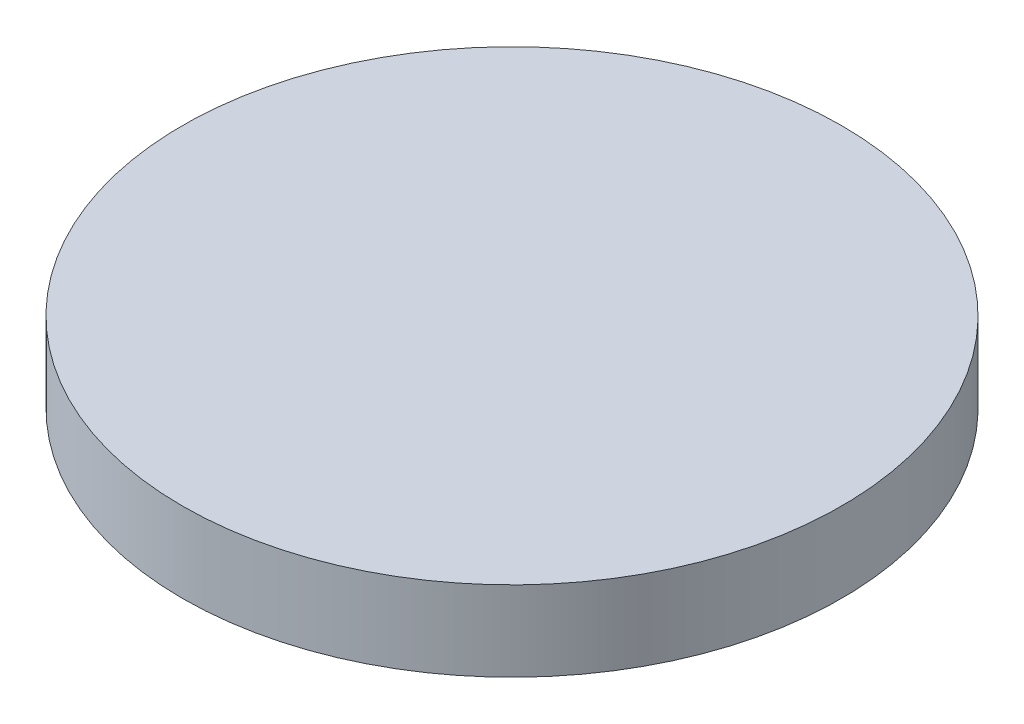
ISO-10303-21;
HEADER;
FILE_DESCRIPTION(('STEP AP214'),'2;1');
FILE_NAME('part.step','',(''),(''),'','','');
FILE_SCHEMA(('AUTOMOTIVE_DESIGN { 1 0 10303 214 1 1 1 1 }'));
ENDSEC;
DATA;
#1=APPLICATION_CONTEXT('core data for automotive mechanical design processes');
#2=APPLICATION_PROTOCOL_DEFINITION('international standard','automotive_design',2000,#1);
#3=PRODUCT_CONTEXT('',#1,'mechanical');
#4=PRODUCT('Part','Part','',(#3));
#5=PRODUCT_RELATED_PRODUCT_CATEGORY('part','',(#4));
#6=PRODUCT_DEFINITION_FORMATION('','',#4);
#7=PRODUCT_DEFINITION_CONTEXT('part definition',#1,'design');
#8=PRODUCT_DEFINITION('design','',#6,#7);
#9=PRODUCT_DEFINITION_SHAPE('','',#8);
#10=(LENGTH_UNIT() NAMED_UNIT(*) SI_UNIT(.MILLI.,.METRE.));
#11=(NAMED_UNIT(*) PLANE_ANGLE_UNIT() SI_UNIT($,.RADIAN.));
#12=(NAMED_UNIT(*) SI_UNIT($,.STERADIAN.) SOLID_ANGLE_UNIT());
#13=UNCERTAINTY_MEASURE_WITH_UNIT(LENGTH_MEASURE(1.E-05),#10,'distance_accuracy_value','');
#14=(GEOMETRIC_REPRESENTATION_CONTEXT(3) GLOBAL_UNCERTAINTY_ASSIGNED_CONTEXT((#13)) GLOBAL_UNIT_ASSIGNED_CONTEXT((#10,
#11,#12)) REPRESENTATION_CONTEXT('',''));
#15=CARTESIAN_POINT('',(0.,0.,0.));
#16=DIRECTION('',(0.,0.,1.));
#17=DIRECTION('',(1.,0.,0.));
#18=AXIS2_PLACEMENT_3D('',#15,#16,#17);
#19=CARTESIAN_POINT('',(0.,7.366,0.));
#20=DIRECTION('',(0.,-1.,0.));
#21=DIRECTION('',(0.,0.,-1.));
#22=AXIS2_PLACEMENT_3D('',#19,#20,#21);
#23=CYLINDRICAL_SURFACE('',#22,30.335461419149);
#24=CARTESIAN_POINT('',(0.,7.366,0.));
#25=DIRECTION('',(0.,1.,0.));
#26=DIRECTION('',(0.,0.,1.));
#27=AXIS2_PLACEMENT_3D('',#24,#25,#26);
#28=CIRCLE('',#27,30.335461419149);
#29=CARTESIAN_POINT('',(0.,7.366,-30.335461419149));
#30=VERTEX_POINT('',#29);
#31=EDGE_CURVE('E10',#30,#30,#28,.T.);
#32=CARTESIAN_POINT('',(0.,0.,0.));
#33=DIRECTION('',(0.,1.,0.));
#34=DIRECTION('',(0.,0.,1.));
#35=AXIS2_PLACEMENT_3D('',#32,#33,#34);
#36=CIRCLE('',#35,30.335461419149);
#37=CARTESIAN_POINT('',(0.,0.,-30.335461419149));
#38=VERTEX_POINT('',#37);
#39=EDGE_CURVE('E38',#38,#38,#36,.T.);
#40=CARTESIAN_POINT('',(0.,7.366,-30.335461419149));
#41=CARTESIAN_POINT('',(0.,7.28927083333333,-30.335461419149));
#42=CARTESIAN_POINT('',(0.,7.21254166666667,-30.335461419149));
#43=CARTESIAN_POINT('',(0.,7.05908333333333,-30.335461419149));
#44=CARTESIAN_POINT('',(0.,6.98235416666667,-30.335461419149));
#45=CARTESIAN_POINT('',(0.,6.82889583333333,-30.335461419149));
#46=CARTESIAN_POINT('',(0.,6.75216666666667,-30.335461419149));
#47=CARTESIAN_POINT('',(0.,6.59870833333333,-30.335461419149));
#48=CARTESIAN_POINT('',(0.,6.52197916666667,-30.335461419149));
#49=CARTESIAN_POINT('',(0.,6.36852083333333,-30.335461419149));
#50=CARTESIAN_POINT('',(0.,6.29179166666667,-30.335461419149));
#51=CARTESIAN_POINT('',(0.,6.13833333333333,-30.335461419149));
#52=CARTESIAN_POINT('',(0.,6.06160416666667,-30.335461419149));
#53=CARTESIAN_POINT('',(0.,5.90814583333333,-30.335461419149));
#54=CARTESIAN_POINT('',(0.,5.83141666666667,-30.335461419149));
#55=CARTESIAN_POINT('',(0.,5.67795833333333,-30.335461419149));
#56=CARTESIAN_POINT('',(0.,5.60122916666667,-30.335461419149));
#57=CARTESIAN_POINT('',(0.,5.44777083333333,-30.335461419149));
#58=CARTESIAN_POINT('',(0.,5.37104166666667,-30.335461419149));
#59=CARTESIAN_POINT('',(0.,5.21758333333333,-30.335461419149));
#60=CARTESIAN_POINT('',(0.,5.14085416666667,-30.335461419149));
#61=CARTESIAN_POINT('',(0.,4.98739583333333,-30.335461419149));
#62=CARTESIAN_POINT('',(0.,4.91066666666667,-30.335461419149));
#63=CARTESIAN_POINT('',(0.,4.75720833333333,-30.335461419149));
#64=CARTESIAN_POINT('',(0.,4.68047916666667,-30.335461419149));
#65=CARTESIAN_POINT('',(0.,4.52702083333333,-30.335461419149));
#66=CARTESIAN_POINT('',(0.,4.45029166666667,-30.335461419149));
#67=CARTESIAN_POINT('',(0.,4.29683333333333,-30.335461419149));
#68=CARTESIAN_POINT('',(0.,4.22010416666667,-30.335461419149));
#69=CARTESIAN_POINT('',(0.,4.06664583333333,-30.335461419149));
#70=CARTESIAN_POINT('',(0.,3.98991666666667,-30.335461419149));
#71=CARTESIAN_POINT('',(0.,3.83645833333333,-30.335461419149));
#72=CARTESIAN_POINT('',(0.,3.75972916666667,-30.335461419149));
#73=CARTESIAN_POINT('',(0.,3.60627083333333,-30.335461419149));
#74=CARTESIAN_POINT('',(0.,3.52954166666667,-30.335461419149));
#75=CARTESIAN_POINT('',(0.,3.37608333333333,-30.335461419149));
#76=CARTESIAN_POINT('',(0.,3.29935416666667,-30.335461419149));
#77=CARTESIAN_POINT('',(0.,3.14589583333333,-30.335461419149));
#78=CARTESIAN_POINT('',(0.,3.06916666666667,-30.335461419149));
#79=CARTESIAN_POINT('',(0.,2.91570833333333,-30.335461419149));
#80=CARTESIAN_POINT('',(0.,2.83897916666667,-30.335461419149));
#81=CARTESIAN_POINT('',(0.,2.68552083333333,-30.335461419149));
#82=CARTESIAN_POINT('',(0.,2.60879166666667,-30.335461419149));
#83=CARTESIAN_POINT('',(0.,2.45533333333333,-30.335461419149));
#84=CARTESIAN_POINT('',(0.,2.37860416666667,-30.335461419149));
#85=CARTESIAN_POINT('',(0.,2.22514583333333,-30.335461419149));
#86=CARTESIAN_POINT('',(0.,2.14841666666667,-30.335461419149));
#87=CARTESIAN_POINT('',(0.,1.99495833333333,-30.335461419149));
#88=CARTESIAN_POINT('',(0.,1.91822916666667,-30.335461419149));
#89=CARTESIAN_POINT('',(0.,1.76477083333333,-30.335461419149));
#90=CARTESIAN_POINT('',(0.,1.68804166666667,-30.335461419149));
#91=CARTESIAN_POINT('',(0.,1.53458333333333,-30.335461419149));
#92=CARTESIAN_POINT('',(0.,1.45785416666667,-30.335461419149));
#93=CARTESIAN_POINT('',(0.,1.30439583333333,-30.335461419149));
#94=CARTESIAN_POINT('',(0.,1.22766666666667,-30.335461419149));
#95=CARTESIAN_POINT('',(0.,1.07420833333333,-30.335461419149));
#96=CARTESIAN_POINT('',(0.,0.997479166666666,-30.335461419149));
#97=CARTESIAN_POINT('',(0.,0.844020833333333,-30.335461419149));
#98=CARTESIAN_POINT('',(0.,0.767291666666667,-30.335461419149));
#99=CARTESIAN_POINT('',(0.,0.613833333333333,-30.335461419149));
#100=CARTESIAN_POINT('',(0.,0.537104166666667,-30.335461419149));
#101=CARTESIAN_POINT('',(0.,0.383645833333333,-30.335461419149));
#102=CARTESIAN_POINT('',(0.,0.306916666666667,-30.335461419149));
#103=CARTESIAN_POINT('',(0.,0.153458333333334,-30.335461419149));
#104=CARTESIAN_POINT('',(0.,0.0767291666666668,-30.335461419149));
#105=CARTESIAN_POINT('',(0.,0.,-30.335461419149));
#106=B_SPLINE_CURVE_WITH_KNOTS('',3,(#40,#41,#42,#43,#44,#45,#46,#47,#48,#49,#50,#51,#52,#53,
#54,#55,#56,#57,#58,#59,#60,#61,#62,#63,#64,#65,#66,#67,#68,#69,#70,#71,#72,#73,#74,#75,#76,#77,
#78,#79,#80,#81,#82,#83,#84,#85,#86,#87,#88,#89,#90,#91,#92,#93,#94,#95,#96,#97,#98,#99,#100,
#101,#102,#103,#104,#105),.UNSPECIFIED.,.F.,.F.,(4,2,2,2,2,2,2,2,2,2,2,2,2,2,2,2,2,2,2,2,2,2,2,
2,2,2,2,2,2,2,2,2,4),(0.,0.230187499999999,0.460375,0.690562499999999,0.92075,1.1509375,
1.381125,1.6113125,1.8415,2.0716875,2.301875,2.5320625,2.76225,2.9924375,3.222625,3.4528125,
3.683,3.9131875,4.143375,4.3735625,4.60375,4.8339375,5.064125,5.2943125,5.5245,5.7546875,
5.984875,6.2150625,6.44525,6.6754375,6.905625,7.1358125,7.366),.UNSPECIFIED.);
#107=EDGE_CURVE('BSEAM35',#30,#38,#106,.T.);
#108=ORIENTED_EDGE('',*,*,#31,.F.);
#109=ORIENTED_EDGE('',*,*,#39,.T.);
#110=ORIENTED_EDGE('',*,*,#107,.T.);
#111=ORIENTED_EDGE('',*,*,#107,.F.);
#112=EDGE_LOOP('',(#108,#110,#109,#111));
#113=FACE_BOUND('',#112,.T.);
#114=ADVANCED_FACE('F35',(#113),#23,.T.);
#115=CARTESIAN_POINT('',(0.,7.366,0.));
#116=DIRECTION('',(0.,1.,0.));
#117=DIRECTION('',(0.,0.,1.));
#118=AXIS2_PLACEMENT_3D('',#115,#116,#117);
#119=PLANE('',#118);
#120=ORIENTED_EDGE('',*,*,#31,.T.);
#121=EDGE_LOOP('',(#120));
#122=FACE_BOUND('',#121,.T.);
#123=ADVANCED_FACE('F50',(#122),#119,.T.);
#124=CARTESIAN_POINT('',(0.,0.,0.));
#125=DIRECTION('',(0.,1.,0.));
#126=DIRECTION('',(0.,0.,1.));
#127=AXIS2_PLACEMENT_3D('',#124,#125,#126);
#128=PLANE('',#127);
#129=ORIENTED_EDGE('',*,*,#39,.F.);
#130=EDGE_LOOP('',(#129));
#131=FACE_BOUND('',#130,.T.);
#132=ADVANCED_FACE('F48',(#131),#128,.F.);
#133=CLOSED_SHELL('',(#114,#123,#132));
#134=MANIFOLD_SOLID_BREP('B2',#133);
#135=ADVANCED_BREP_SHAPE_REPRESENTATION('',(#18,#134),#14);
#136=SHAPE_DEFINITION_REPRESENTATION(#9,#135);
ENDSEC;
END-ISO-10303-21;
